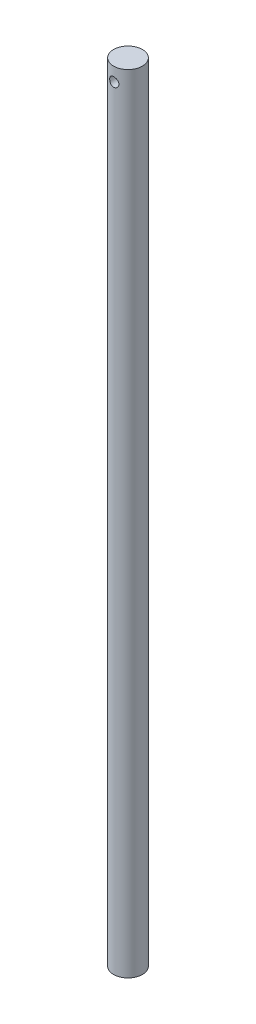
ISO-10303-21;
HEADER;
FILE_DESCRIPTION(('STEP AP214'),'2;1');
FILE_NAME('part.step','',(''),(''),'','','');
FILE_SCHEMA(('AUTOMOTIVE_DESIGN { 1 0 10303 214 1 1 1 1 }'));
ENDSEC;
DATA;
#1=APPLICATION_CONTEXT('core data for automotive mechanical design processes');
#2=APPLICATION_PROTOCOL_DEFINITION('international standard','automotive_design',2000,#1);
#3=PRODUCT_CONTEXT('',#1,'mechanical');
#4=PRODUCT('Part','Part','',(#3));
#5=PRODUCT_RELATED_PRODUCT_CATEGORY('part','',(#4));
#6=PRODUCT_DEFINITION_FORMATION('','',#4);
#7=PRODUCT_DEFINITION_CONTEXT('part definition',#1,'design');
#8=PRODUCT_DEFINITION('design','',#6,#7);
#9=PRODUCT_DEFINITION_SHAPE('','',#8);
#10=(LENGTH_UNIT() NAMED_UNIT(*) SI_UNIT(.MILLI.,.METRE.));
#11=(NAMED_UNIT(*) PLANE_ANGLE_UNIT() SI_UNIT($,.RADIAN.));
#12=(NAMED_UNIT(*) SI_UNIT($,.STERADIAN.) SOLID_ANGLE_UNIT());
#13=UNCERTAINTY_MEASURE_WITH_UNIT(LENGTH_MEASURE(1.E-05),#10,'distance_accuracy_value','');
#14=(GEOMETRIC_REPRESENTATION_CONTEXT(3) GLOBAL_UNCERTAINTY_ASSIGNED_CONTEXT((#13)) GLOBAL_UNIT_ASSIGNED_CONTEXT((#10,
#11,#12)) REPRESENTATION_CONTEXT('',''));
#15=CARTESIAN_POINT('',(0.,0.,0.));
#16=DIRECTION('',(0.,0.,1.));
#17=DIRECTION('',(1.,0.,0.));
#18=AXIS2_PLACEMENT_3D('',#15,#16,#17);
#19=CARTESIAN_POINT('',(0.,539.75,0.));
#20=DIRECTION('',(0.,-1.,0.));
#21=DIRECTION('',(0.,0.,-0.999999999999999));
#22=AXIS2_PLACEMENT_3D('',#19,#20,#21);
#23=CYLINDRICAL_SURFACE('',#22,9.906);
#24=CARTESIAN_POINT('',(0.,533.527,-9.90599999999997));
#25=CARTESIAN_POINT('',(-0.173609902491017,533.526999562888,-9.90599960619149));
#26=CARTESIAN_POINT('',(-0.347225398017927,533.51271373406,-9.90139333086974));
#27=CARTESIAN_POINT('',(-0.689365221433602,533.456107084769,-9.88347017382777));
#28=CARTESIAN_POINT('',(-0.857888629518188,533.413781230604,-9.87015172811801));
#29=CARTESIAN_POINT('',(-1.18486166247144,533.302678440052,-9.83625624568887));
#30=CARTESIAN_POINT('',(-1.34332688816813,533.233943694529,-9.81569079111508));
#31=CARTESIAN_POINT('',(-1.64648190541337,533.07215799888,-9.76941547337632));
#32=CARTESIAN_POINT('',(-1.79116930708735,532.979102840628,-9.74370472010803));
#33=CARTESIAN_POINT('',(-2.06733686946794,532.768155524504,-9.68892998382753));
#34=CARTESIAN_POINT('',(-2.19830974194692,532.649619019658,-9.65979015664063));
#35=CARTESIAN_POINT('',(-2.43889855110535,532.392444978284,-9.60187236921282));
#36=CARTESIAN_POINT('',(-2.54851024585281,532.25380345879,-9.57309448190567));
#37=CARTESIAN_POINT('',(-2.74607030021566,531.955897265666,-9.51833735222272));
#38=CARTESIAN_POINT('',(-2.83337525522305,531.796187150229,-9.49245128031127));
#39=CARTESIAN_POINT('',(-2.97967372292543,531.463387460439,-9.44755414746726));
#40=CARTESIAN_POINT('',(-3.03867513572306,531.290301635202,-9.42854116847819));
#41=CARTESIAN_POINT('',(-3.12481771766603,530.941405498296,-9.40033826236137));
#42=CARTESIAN_POINT('',(-3.15290358961553,530.765852582549,-9.39085788221591));
#43=CARTESIAN_POINT('',(-3.17937000071983,530.412289999131,-9.38193240497491));
#44=CARTESIAN_POINT('',(-3.17775891225298,530.234281038026,-9.38248447945778));
#45=CARTESIAN_POINT('',(-3.14561397447135,529.888763995362,-9.3933058482075));
#46=CARTESIAN_POINT('',(-3.11629289268759,529.721128149536,-9.40316766840545));
#47=CARTESIAN_POINT('',(-3.03153118530711,529.393293570519,-9.43083358389489));
#48=CARTESIAN_POINT('',(-2.97608765197581,529.23309566744,-9.44863856334124));
#49=CARTESIAN_POINT('',(-2.83982230651689,528.921846043877,-9.49048854523283));
#50=CARTESIAN_POINT('',(-2.75862784873794,528.770970183295,-9.51462421152639));
#51=CARTESIAN_POINT('',(-2.57342419732892,528.484592346352,-9.56637589250178));
#52=CARTESIAN_POINT('',(-2.46940882175763,528.349094550863,-9.5939928493637));
#53=CARTESIAN_POINT('',(-2.23561258606349,528.090478214256,-9.65121815259726));
#54=CARTESIAN_POINT('',(-2.10483414563026,527.968266850427,-9.68085843574051));
#55=CARTESIAN_POINT('',(-1.82427118883873,527.747283363236,-9.73762439035455));
#56=CARTESIAN_POINT('',(-1.67448511597193,527.648513161341,-9.76474985557523));
#57=CARTESIAN_POINT('',(-1.35834430530905,527.476557925074,-9.81374066213935));
#58=CARTESIAN_POINT('',(-1.19185862460487,527.403599313268,-9.83555895224433));
#59=CARTESIAN_POINT('',(-0.848113440881126,527.286997824111,-9.87113681375028));
#60=CARTESIAN_POINT('',(-0.670857406295874,527.243345563073,-9.88489896448935));
#61=CARTESIAN_POINT('',(-0.318295778720523,527.18816452681,-9.90239423836444));
#62=CARTESIAN_POINT('',(-0.143200992861697,527.175408529173,-9.90651028455424));
#63=CARTESIAN_POINT('',(0.20665161365513,527.17890848489,-9.90538811068439));
#64=CARTESIAN_POINT('',(0.381409482212489,527.195159954377,-9.90015133634895));
#65=CARTESIAN_POINT('',(0.72082669416262,527.25523341978,-9.88116404490638));
#66=CARTESIAN_POINT('',(0.885630831320389,527.29831648951,-9.86764185931522));
#67=CARTESIAN_POINT('',(1.20561809048523,527.409920177116,-9.83367845066402));
#68=CARTESIAN_POINT('',(1.360800004428,527.478443981544,-9.81323636088688));
#69=CARTESIAN_POINT('',(1.66148120335942,527.64090432677,-9.76688558886116));
#70=CARTESIAN_POINT('',(1.80663891650736,527.735436526499,-9.74085237786596));
#71=CARTESIAN_POINT('',(2.0794378917213,527.946521354015,-9.68628717124927));
#72=CARTESIAN_POINT('',(2.20707415394862,528.063080244778,-9.65775446617309));
#73=CARTESIAN_POINT('',(2.44675300704344,528.320683190268,-9.59990021881133));
#74=CARTESIAN_POINT('',(2.55792031260372,528.462547325862,-9.57059558450072));
#75=CARTESIAN_POINT('',(2.75496069597508,528.763551670835,-9.5157513522842));
#76=CARTESIAN_POINT('',(2.84083396786869,528.922691747641,-9.49021172548991));
#77=CARTESIAN_POINT('',(2.98435995368107,529.253539233717,-9.44606192072128));
#78=CARTESIAN_POINT('',(3.0421042500275,529.425203738166,-9.42742930289134));
#79=CARTESIAN_POINT('',(3.12763984852172,529.776545356796,-9.39940265911436));
#80=CARTESIAN_POINT('',(3.15544332309708,529.956219183829,-9.39000487888431));
#81=CARTESIAN_POINT('',(3.17940467711253,530.309290263017,-9.38191687101765));
#82=CARTESIAN_POINT('',(3.177004693567,530.48257962913,-9.38273866215154));
#83=CARTESIAN_POINT('',(3.14413430111195,530.826153212945,-9.39380377277647));
#84=CARTESIAN_POINT('',(3.11366533227294,530.99643758436,-9.40404660892369));
#85=CARTESIAN_POINT('',(3.02650883197364,531.326441192232,-9.43245006297343));
#86=CARTESIAN_POINT('',(2.97025442710731,531.486286966697,-9.45047960654129));
#87=CARTESIAN_POINT('',(2.83346833921744,531.794397348049,-9.49238570103301));
#88=CARTESIAN_POINT('',(2.75293153900799,531.942659505545,-9.51626348419491));
#89=CARTESIAN_POINT('',(2.56602165520535,532.229954622222,-9.56839249454128));
#90=CARTESIAN_POINT('',(2.45872740563249,532.368362996902,-9.5967825500602));
#91=CARTESIAN_POINT('',(2.22294501353811,532.62567702225,-9.65412099621146));
#92=CARTESIAN_POINT('',(2.09445108318168,532.74457732919,-9.68306953740761));
#93=CARTESIAN_POINT('',(1.81451116535256,532.963675934385,-9.73947869760118));
#94=CARTESIAN_POINT('',(1.66241940208226,533.063074282695,-9.76685181288889));
#95=CARTESIAN_POINT('',(1.34281170426934,533.234769298846,-9.81589390999574));
#96=CARTESIAN_POINT('',(1.17530107355127,533.307075242929,-9.83756484344285));
#97=CARTESIAN_POINT('',(0.841628915490747,533.418108442957,-9.871506228736));
#98=CARTESIAN_POINT('',(0.676182895544215,533.458820324815,-9.88432538224971));
#99=CARTESIAN_POINT('',(0.340492306755675,533.513263237149,-9.90157150280816));
#100=CARTESIAN_POINT('',(0.170248842663651,533.52700042865,-9.90600038618438));
#101=CARTESIAN_POINT('',(0.,533.527,-9.90599999999997));
#102=B_SPLINE_CURVE_WITH_KNOTS('',3,(#24,#25,#26,#27,#28,#29,#30,#31,#32,#33,#34,#35,#36,#37,
#38,#39,#40,#41,#42,#43,#44,#45,#46,#47,#48,#49,#50,#51,#52,#53,#54,#55,#56,#57,#58,#59,#60,#61,
#62,#63,#64,#65,#66,#67,#68,#69,#70,#71,#72,#73,#74,#75,#76,#77,#78,#79,#80,#81,#82,#83,#84,#85,
#86,#87,#88,#89,#90,#91,#92,#93,#94,#95,#96,#97,#98,#99,#100,#101),.UNSPECIFIED.,.T.,.F.,(4,2,2,
2,2,2,2,2,2,2,2,2,2,2,2,2,2,2,2,2,2,2,2,2,2,2,2,2,2,2,2,2,2,2,2,2,2,2,4),(0.,0.520203653190161,
1.04050071782686,1.55996998879536,2.0795292023826,2.61421803209689,3.14901293309829,
3.69783084299905,4.24649547723616,4.77788401275623,5.30912273773191,5.81813774594534,
6.32720942687725,6.84401266954647,7.36095608188884,7.90272878350445,8.44454587879497,
8.99100443008409,9.53728792564177,10.0614885570786,10.5856081665447,11.0958958548675,
11.6062474803185,12.1294314627598,12.6527644295539,13.1979818527921,13.7431950924378,
14.2866211591326,14.8298262127013,15.3471971329634,15.8645415111506,16.3734975018373,
16.8825608231597,17.4124232772657,17.9424306319823,18.4909828852277,19.0393471461225,
19.5495962947257,20.0597288887446),.UNSPECIFIED.);
#103=CARTESIAN_POINT('',(0.,533.527,-9.90599999999997));
#104=VERTEX_POINT('',#103);
#105=EDGE_CURVE('E10',#104,#104,#102,.T.);
#106=ORIENTED_EDGE('',*,*,#105,.T.);
#107=EDGE_LOOP('',(#106));
#108=FACE_BOUND('',#107,.T.);
#109=CARTESIAN_POINT('',(3.17499999999993,530.352,9.38340082272976));
#110=CARTESIAN_POINT('',(3.17499953903497,530.178648845424,9.3834013301093));
#111=CARTESIAN_POINT('',(3.16075472323989,530.005292093388,9.3882571596395));
#112=CARTESIAN_POINT('',(3.1043257570463,529.663687818861,9.40706434772509));
#113=CARTESIAN_POINT('',(3.06213519751662,529.495441477662,9.42101779273379));
#114=CARTESIAN_POINT('',(2.95142750605795,529.16905768367,9.45628094770399));
#115=CARTESIAN_POINT('',(2.88295883397281,529.010902244538,9.47757710955213));
#116=CARTESIAN_POINT('',(2.72180167990537,528.70827622172,9.52510700553782));
#117=CARTESIAN_POINT('',(2.6291085050566,528.56380829703,9.55134169611096));
#118=CARTESIAN_POINT('',(2.41854478822544,528.287435871301,9.60685630655815));
#119=CARTESIAN_POINT('',(2.29994827423896,528.156098733426,9.63620787712056));
#120=CARTESIAN_POINT('',(2.04249629356487,527.914794838139,9.69404093579795));
#121=CARTESIAN_POINT('',(1.90363784777251,527.804831228824,9.72252229522008));
#122=CARTESIAN_POINT('',(1.60549943387127,527.606865608948,9.77622921809115));
#123=CARTESIAN_POINT('',(1.4458104845676,527.519451735604,9.80136062407841));
#124=CARTESIAN_POINT('',(1.11305344149491,527.372946469813,9.84469647245608));
#125=CARTESIAN_POINT('',(0.939988677802039,527.313848054089,9.86290263233185));
#126=CARTESIAN_POINT('',(0.591336355969282,527.227556830947,9.88982935915231));
#127=CARTESIAN_POINT('',(0.416011653478186,527.199393464855,9.89883780880965));
#128=CARTESIAN_POINT('',(0.0629093181981861,527.172692550356,9.90737280091701));
#129=CARTESIAN_POINT('',(-0.114867718751752,527.174147927961,9.9069016074363));
#130=CARTESIAN_POINT('',(-0.460982753354984,527.206013338169,9.89672883378002));
#131=CARTESIAN_POINT('',(-0.629429142765718,527.235370479982,9.88736291172926));
#132=CARTESIAN_POINT('',(-0.958864233681672,527.32047336135,9.86086911434456));
#133=CARTESIAN_POINT('',(-1.11985244005594,527.376220850147,9.84374072449053));
#134=CARTESIAN_POINT('',(-1.43218240257429,527.513174871574,9.80320475439355));
#135=CARTESIAN_POINT('',(-1.58337705006024,527.594693346281,9.77972077356497));
#136=CARTESIAN_POINT('',(-1.87026250480178,527.780622591593,9.7289367364875));
#137=CARTESIAN_POINT('',(-2.00594922462362,527.885039376449,9.70163567836553));
#138=CARTESIAN_POINT('',(-2.26424039095289,528.119169584741,9.64470398038782));
#139=CARTESIAN_POINT('',(-2.38601336778437,528.249789491973,9.61502367587063));
#140=CARTESIAN_POINT('',(-2.60618195859911,528.529865234723,9.55769991346084));
#141=CARTESIAN_POINT('',(-2.70457451277714,528.679323531717,9.53005672249232));
#142=CARTESIAN_POINT('',(-2.87622483297353,528.995289872861,9.47967827585154));
#143=CARTESIAN_POINT('',(-2.94915858260904,529.161985004097,9.45700756438134));
#144=CARTESIAN_POINT('',(-3.06565137470012,529.506195456073,9.41989380058999));
#145=CARTESIAN_POINT('',(-3.10922162630257,529.683706619679,9.40544760898888));
#146=CARTESIAN_POINT('',(-3.16411316255726,530.036510345579,9.38712048822753));
#147=CARTESIAN_POINT('',(-3.17671375743831,530.211582198877,9.3828207412646));
#148=CARTESIAN_POINT('',(-3.17291201870702,530.561356226441,9.38410752367474));
#149=CARTESIAN_POINT('',(-3.15651445578884,530.736058456783,9.38969242685351));
#150=CARTESIAN_POINT('',(-3.09632761940797,531.074510097642,9.4097041875611));
#151=CARTESIAN_POINT('',(-3.05340110038983,531.238431146569,9.42385227170713));
#152=CARTESIAN_POINT('',(-2.94239621229271,531.556720351873,9.45909661381937));
#153=CARTESIAN_POINT('',(-2.87431360268504,531.711086892535,9.48019404316234));
#154=CARTESIAN_POINT('',(-2.71261315798636,532.010987774903,9.52774108643856));
#155=CARTESIAN_POINT('',(-2.61829369124773,532.156120873992,9.55433167781738));
#156=CARTESIAN_POINT('',(-2.40760687283767,532.428964480415,9.60958408880192));
#157=CARTESIAN_POINT('',(-2.29123349948749,532.5566702129,9.63824647277213));
#158=CARTESIAN_POINT('',(-2.03366431016805,532.796826024731,9.69593652535422));
#159=CARTESIAN_POINT('',(-1.8916025666438,532.908359361769,9.72492491808367));
#160=CARTESIAN_POINT('',(-1.59007310585201,533.106048768724,9.77874854404611));
#161=CARTESIAN_POINT('',(-1.43060612799756,533.192205916104,9.80358395359367));
#162=CARTESIAN_POINT('',(-1.09971270486085,533.335881003148,9.84617005172761));
#163=CARTESIAN_POINT('',(-0.928380168389652,533.393599782449,9.86397024277408));
#164=CARTESIAN_POINT('',(-0.577764235401466,533.479194998655,9.89069687851548));
#165=CARTESIAN_POINT('',(-0.398483490340081,533.507081310561,9.89962625951373));
#166=CARTESIAN_POINT('',(-0.0454781964174911,533.531384680091,9.90740032725755));
#167=CARTESIAN_POINT('',(0.12814712654614,533.529122716186,9.90666835072813));
#168=CARTESIAN_POINT('',(0.472430473192723,533.496412425482,9.89622665348619));
#169=CARTESIAN_POINT('',(0.643088706839363,533.465966101465,9.88651757068743));
#170=CARTESIAN_POINT('',(0.974277122404256,533.378606592941,9.85935481238185));
#171=CARTESIAN_POINT('',(1.13491424665936,533.322062816329,9.84200938210136));
#172=CARTESIAN_POINT('',(1.44449364041946,533.184449997697,9.80136097448063));
#173=CARTESIAN_POINT('',(1.59343385144346,533.103376650968,9.77805695157494));
#174=CARTESIAN_POINT('',(1.88108625417521,532.915719324097,9.72689320608759));
#175=CARTESIAN_POINT('',(2.01925567841203,532.808339546976,9.69890225138931));
#176=CARTESIAN_POINT('',(2.27605033064847,532.572501940288,9.6418756623693));
#177=CARTESIAN_POINT('',(2.39466954181589,532.444037645875,9.61283970977319));
#178=CARTESIAN_POINT('',(2.61324313994997,532.164235401769,9.55578495937854));
#179=CARTESIAN_POINT('',(2.71238880180858,532.012249046372,9.52783848079125));
#180=CARTESIAN_POINT('',(2.88363592085697,531.692918613244,9.4774200367405));
#181=CARTESIAN_POINT('',(2.95574689692768,531.525579966917,9.45494614536423));
#182=CARTESIAN_POINT('',(3.06644435894384,531.1923403432,9.41960211858913));
#183=CARTESIAN_POINT('',(3.10702803003369,531.027162274879,9.406168791036));
#184=CARTESIAN_POINT('',(3.16130230167818,530.691990354999,9.38806912491442));
#185=CARTESIAN_POINT('',(3.17500045204803,530.521997869,9.38340032516491));
#186=CARTESIAN_POINT('',(3.17499999999993,530.352,9.38340082272976));
#187=B_SPLINE_CURVE_WITH_KNOTS('',3,(#109,#110,#111,#112,#113,#114,#115,#116,#117,#118,#119,
#120,#121,#122,#123,#124,#125,#126,#127,#128,#129,#130,#131,#132,#133,#134,#135,#136,#137,#138,
#139,#140,#141,#142,#143,#144,#145,#146,#147,#148,#149,#150,#151,#152,#153,#154,#155,#156,#157,
#158,#159,#160,#161,#162,#163,#164,#165,#166,#167,#168,#169,#170,#171,#172,#173,#174,#175,#176,
#177,#178,#179,#180,#181,#182,#183,#184,#185,#186),.UNSPECIFIED.,.T.,.F.,(4,2,2,2,2,2,2,2,2,2,2,
2,2,2,2,2,2,2,2,2,2,2,2,2,2,2,2,2,2,2,2,2,2,2,2,2,2,2,4),(0.,0.519424913270087,1.03896899372489,
1.5575595436682,2.07625063159044,2.61195145698121,3.14773112578959,3.69632464246902,
4.24478201718652,4.77549171645936,5.3060746652591,5.8173989305346,6.32875709290437,
6.84655855087931,7.36449617288691,7.90508126396088,8.44573706270575,8.9930423917129,
9.5401386752568,10.0642241589067,10.5882234295297,11.0960183198062,11.6038988474712,
12.1269412246057,12.6501266214327,13.1962977107939,13.7424456066162,14.284679101558,
14.8267330533657,15.3451174273334,15.8634649677041,16.3746903114134,16.8860054224305,
17.4152743224353,17.94470580888,18.4928662860359,19.0408335748639,19.5503538906461,
20.0597311057994),.UNSPECIFIED.);
#188=CARTESIAN_POINT('',(3.17499999999993,530.352,9.38340082272976));
#189=VERTEX_POINT('',#188);
#190=EDGE_CURVE('E53',#189,#189,#187,.T.);
#191=ORIENTED_EDGE('',*,*,#190,.T.);
#192=EDGE_LOOP('',(#191));
#193=FACE_BOUND('',#192,.T.);
#194=CARTESIAN_POINT('',(0.,539.75,0.));
#195=DIRECTION('',(0.,1.,0.));
#196=DIRECTION('',(0.,0.,0.999999999999999));
#197=AXIS2_PLACEMENT_3D('',#194,#195,#196);
#198=CIRCLE('',#197,9.906);
#199=CARTESIAN_POINT('',(0.,539.75,9.90600000000005));
#200=VERTEX_POINT('',#199);
#201=EDGE_CURVE('E59',#200,#200,#198,.T.);
#202=ORIENTED_EDGE('',*,*,#201,.F.);
#203=EDGE_LOOP('',(#202));
#204=FACE_BOUND('',#203,.T.);
#205=CARTESIAN_POINT('',(0.,0.,0.));
#206=DIRECTION('',(0.,1.,0.));
#207=DIRECTION('',(0.,0.,0.999999999999999));
#208=AXIS2_PLACEMENT_3D('',#205,#206,#207);
#209=CIRCLE('',#208,9.906);
#210=CARTESIAN_POINT('',(0.,0.,9.90599999999999));
#211=VERTEX_POINT('',#210);
#212=EDGE_CURVE('E65',#211,#211,#209,.T.);
#213=ORIENTED_EDGE('',*,*,#212,.T.);
#214=EDGE_LOOP('',(#213));
#215=FACE_BOUND('',#214,.T.);
#216=ADVANCED_FACE('F41',(#108,#193,#204,#215),#23,.T.);
#217=CARTESIAN_POINT('',(0.,539.75,0.));
#218=DIRECTION('',(0.,1.,0.));
#219=DIRECTION('',(0.,0.,0.999999999999999));
#220=AXIS2_PLACEMENT_3D('',#217,#218,#219);
#221=PLANE('',#220);
#222=ORIENTED_EDGE('',*,*,#201,.T.);
#223=EDGE_LOOP('',(#222));
#224=FACE_BOUND('',#223,.T.);
#225=ADVANCED_FACE('F77',(#224),#221,.T.);
#226=CARTESIAN_POINT('',(0.,0.,0.));
#227=DIRECTION('',(0.,1.,0.));
#228=DIRECTION('',(0.,0.,0.999999999999999));
#229=AXIS2_PLACEMENT_3D('',#226,#227,#228);
#230=PLANE('',#229);
#231=ORIENTED_EDGE('',*,*,#212,.F.);
#232=EDGE_LOOP('',(#231));
#233=FACE_BOUND('',#232,.T.);
#234=ADVANCED_FACE('F75',(#233),#230,.F.);
#235=CARTESIAN_POINT('',(0.,530.352,-9.9059999999998));
#236=DIRECTION('',(0.,0.,0.999999999999999));
#237=DIRECTION('',(0.999999999999999,0.,0.));
#238=AXIS2_PLACEMENT_3D('',#235,#236,#237);
#239=CYLINDRICAL_SURFACE('',#238,3.175);
#240=ORIENTED_EDGE('',*,*,#190,.F.);
#241=EDGE_LOOP('',(#240));
#242=FACE_BOUND('',#241,.T.);
#243=ORIENTED_EDGE('',*,*,#105,.F.);
#244=EDGE_LOOP('',(#243));
#245=FACE_BOUND('',#244,.T.);
#246=ADVANCED_FACE('F71',(#242,#245),#239,.F.);
#247=CLOSED_SHELL('',(#216,#225,#234,#246));
#248=MANIFOLD_SOLID_BREP('B2',#247);
#249=ADVANCED_BREP_SHAPE_REPRESENTATION('',(#18,#248),#14);
#250=SHAPE_DEFINITION_REPRESENTATION(#9,#249);
ENDSEC;
END-ISO-10303-21;
